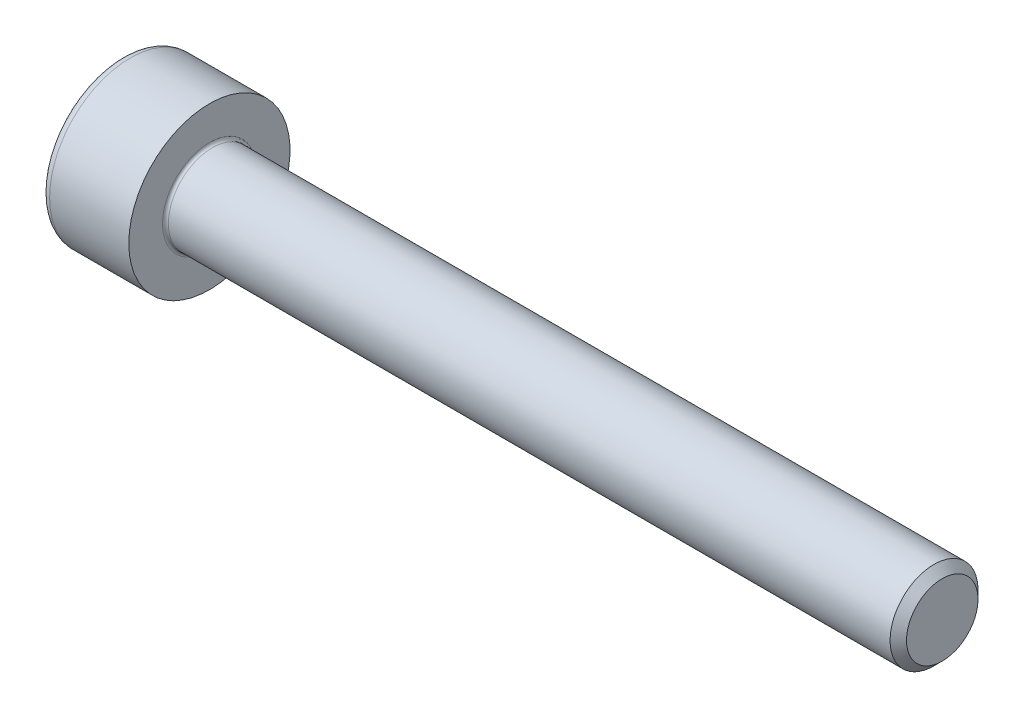
ISO-10303-21;
HEADER;
FILE_DESCRIPTION(('STEP AP214'),'2;1');
FILE_NAME('part.step','',(''),(''),'','','');
FILE_SCHEMA(('AUTOMOTIVE_DESIGN { 1 0 10303 214 1 1 1 1 }'));
ENDSEC;
DATA;
#1=APPLICATION_CONTEXT('core data for automotive mechanical design processes');
#2=APPLICATION_PROTOCOL_DEFINITION('international standard','automotive_design',2000,#1);
#3=PRODUCT_CONTEXT('',#1,'mechanical');
#4=PRODUCT('Part','Part','',(#3));
#5=PRODUCT_RELATED_PRODUCT_CATEGORY('part','',(#4));
#6=PRODUCT_DEFINITION_FORMATION('','',#4);
#7=PRODUCT_DEFINITION_CONTEXT('part definition',#1,'design');
#8=PRODUCT_DEFINITION('design','',#6,#7);
#9=PRODUCT_DEFINITION_SHAPE('','',#8);
#10=(LENGTH_UNIT() NAMED_UNIT(*) SI_UNIT(.MILLI.,.METRE.));
#11=(NAMED_UNIT(*) PLANE_ANGLE_UNIT() SI_UNIT($,.RADIAN.));
#12=(NAMED_UNIT(*) SI_UNIT($,.STERADIAN.) SOLID_ANGLE_UNIT());
#13=UNCERTAINTY_MEASURE_WITH_UNIT(LENGTH_MEASURE(1.E-05),#10,'distance_accuracy_value','');
#14=(GEOMETRIC_REPRESENTATION_CONTEXT(3) GLOBAL_UNCERTAINTY_ASSIGNED_CONTEXT((#13)) GLOBAL_UNIT_ASSIGNED_CONTEXT((#10,
#11,#12)) REPRESENTATION_CONTEXT('',''));
#15=CARTESIAN_POINT('',(0.,0.,0.));
#16=DIRECTION('',(0.,0.,1.));
#17=DIRECTION('',(1.,0.,0.));
#18=AXIS2_PLACEMENT_3D('',#15,#16,#17);
#19=CARTESIAN_POINT('',(0.,0.,0.));
#20=DIRECTION('',(-1.,0.,0.));
#21=DIRECTION('',(0.,0.,1.));
#22=AXIS2_PLACEMENT_3D('',#19,#20,#21);
#23=PLANE('',#22);
#24=DIRECTION('',(0.,-0.499999999999999,0.866025403784439));
#25=VECTOR('',#24,1.);
#26=CARTESIAN_POINT('',(0.,1.45492267835785,0.));
#27=LINE('',#26,#25);
#28=CARTESIAN_POINT('',(0.,1.45492267835785,0.));
#29=VERTEX_POINT('',#28);
#30=CARTESIAN_POINT('',(0.,0.727461339178925,1.26));
#31=VERTEX_POINT('',#30);
#32=EDGE_CURVE('E259',#29,#31,#27,.T.);
#33=ORIENTED_EDGE('',*,*,#32,.T.);
#34=DIRECTION('',(0.,1.,0.));
#35=VECTOR('',#34,1.);
#36=CARTESIAN_POINT('',(0.,-0.727461339178932,1.26));
#37=LINE('',#36,#35);
#38=CARTESIAN_POINT('',(0.,-0.727461339178932,1.26));
#39=VERTEX_POINT('',#38);
#40=EDGE_CURVE('E131',#39,#31,#37,.T.);
#41=ORIENTED_EDGE('',*,*,#40,.F.);
#42=DIRECTION('',(0.,-0.500000000000001,-0.866025403784438));
#43=VECTOR('',#42,1.);
#44=CARTESIAN_POINT('',(0.,-0.727461339178932,1.26));
#45=LINE('',#44,#43);
#46=CARTESIAN_POINT('',(0.,-1.45492267835786,0.));
#47=VERTEX_POINT('',#46);
#48=EDGE_CURVE('E262',#39,#47,#45,.T.);
#49=ORIENTED_EDGE('',*,*,#48,.T.);
#50=DIRECTION('',(0.,0.499999999999999,-0.866025403784439));
#51=VECTOR('',#50,1.);
#52=CARTESIAN_POINT('',(0.,-1.45492267835786,0.));
#53=LINE('',#52,#51);
#54=CARTESIAN_POINT('',(0.,-0.727461339178935,-1.26));
#55=VERTEX_POINT('',#54);
#56=EDGE_CURVE('E265',#47,#55,#53,.T.);
#57=ORIENTED_EDGE('',*,*,#56,.T.);
#58=DIRECTION('',(0.,-1.,0.));
#59=VECTOR('',#58,1.);
#60=CARTESIAN_POINT('',(0.,0.727461339178922,-1.26));
#61=LINE('',#60,#59);
#62=CARTESIAN_POINT('',(0.,0.727461339178922,-1.26));
#63=VERTEX_POINT('',#62);
#64=EDGE_CURVE('E268',#63,#55,#61,.T.);
#65=ORIENTED_EDGE('',*,*,#64,.F.);
#66=DIRECTION('',(0.,-0.500000000000001,-0.866025403784438));
#67=VECTOR('',#66,1.);
#68=CARTESIAN_POINT('',(0.,1.45492267835785,0.));
#69=LINE('',#68,#67);
#70=EDGE_CURVE('E126',#29,#63,#69,.T.);
#71=ORIENTED_EDGE('',*,*,#70,.F.);
#72=EDGE_LOOP('',(#33,#41,#49,#57,#65,#71));
#73=FACE_BOUND('',#72,.T.);
#74=CARTESIAN_POINT('',(0.,0.,0.));
#75=DIRECTION('',(-1.,0.,0.));
#76=DIRECTION('',(0.,0.,1.));
#77=AXIS2_PLACEMENT_3D('',#74,#75,#76);
#78=CIRCLE('',#77,2.45);
#79=CARTESIAN_POINT('',(0.,0.,2.45));
#80=VERTEX_POINT('',#79);
#81=EDGE_CURVE('E43',#80,#80,#78,.T.);
#82=ORIENTED_EDGE('',*,*,#81,.T.);
#83=EDGE_LOOP('',(#82));
#84=FACE_BOUND('',#83,.T.);
#85=ADVANCED_FACE('F35',(#73,#84),#23,.T.);
#86=CARTESIAN_POINT('',(-31.75,0.,0.));
#87=DIRECTION('',(-1.,0.,0.));
#88=DIRECTION('',(0.,0.,1.));
#89=AXIS2_PLACEMENT_3D('',#86,#87,#88);
#90=CYLINDRICAL_SURFACE('',#89,2.75);
#91=CARTESIAN_POINT('',(0.300000000000002,0.,0.));
#92=DIRECTION('',(-1.,0.,0.));
#93=DIRECTION('',(0.,0.,1.));
#94=AXIS2_PLACEMENT_3D('',#91,#92,#93);
#95=CIRCLE('',#94,2.75);
#96=CARTESIAN_POINT('',(0.300000000000002,0.,2.75));
#97=VERTEX_POINT('',#96);
#98=EDGE_CURVE('E11',#97,#97,#95,.F.);
#99=ORIENTED_EDGE('',*,*,#98,.T.);
#100=EDGE_LOOP('',(#99));
#101=FACE_BOUND('',#100,.T.);
#102=CARTESIAN_POINT('',(3.,0.,0.));
#103=DIRECTION('',(-1.,0.,0.));
#104=DIRECTION('',(0.,0.,1.));
#105=AXIS2_PLACEMENT_3D('',#102,#103,#104);
#106=CIRCLE('',#105,2.75);
#107=CARTESIAN_POINT('',(3.,0.,2.75));
#108=VERTEX_POINT('',#107);
#109=EDGE_CURVE('E149',#108,#108,#106,.T.);
#110=ORIENTED_EDGE('',*,*,#109,.T.);
#111=EDGE_LOOP('',(#110));
#112=FACE_BOUND('',#111,.T.);
#113=ADVANCED_FACE('F173',(#101,#112),#90,.T.);
#114=CARTESIAN_POINT('',(3.,2.75,0.));
#115=DIRECTION('',(1.,0.,0.));
#116=DIRECTION('',(0.,0.,-1.));
#117=AXIS2_PLACEMENT_3D('',#114,#115,#116);
#118=PLANE('',#117);
#119=CARTESIAN_POINT('',(3.,0.,0.));
#120=DIRECTION('',(1.,0.,0.));
#121=DIRECTION('',(0.,0.,-1.));
#122=AXIS2_PLACEMENT_3D('',#119,#120,#121);
#123=CIRCLE('',#122,1.59999999999996);
#124=CARTESIAN_POINT('',(3.,0.,-1.59999999999996));
#125=VERTEX_POINT('',#124);
#126=EDGE_CURVE('E152',#125,#125,#123,.F.);
#127=ORIENTED_EDGE('',*,*,#126,.T.);
#128=EDGE_LOOP('',(#127));
#129=FACE_BOUND('',#128,.T.);
#130=ORIENTED_EDGE('',*,*,#109,.F.);
#131=EDGE_LOOP('',(#130));
#132=FACE_BOUND('',#131,.T.);
#133=ADVANCED_FACE('F179',(#129,#132),#118,.T.);
#134=CARTESIAN_POINT('',(-31.75,0.,0.));
#135=DIRECTION('',(-1.,0.,0.));
#136=DIRECTION('',(0.,0.,1.));
#137=AXIS2_PLACEMENT_3D('',#134,#135,#136);
#138=CYLINDRICAL_SURFACE('',#137,1.49999999999996);
#139=CARTESIAN_POINT('',(3.1,0.,0.));
#140=DIRECTION('',(1.,0.,0.));
#141=DIRECTION('',(0.,0.,-1.));
#142=AXIS2_PLACEMENT_3D('',#139,#140,#141);
#143=CIRCLE('',#142,1.49999999999996);
#144=CARTESIAN_POINT('',(3.1,0.,-1.49999999999996));
#145=VERTEX_POINT('',#144);
#146=EDGE_CURVE('E155',#145,#145,#143,.T.);
#147=ORIENTED_EDGE('',*,*,#146,.T.);
#148=EDGE_LOOP('',(#147));
#149=FACE_BOUND('',#148,.T.);
#150=CARTESIAN_POINT('',(27.7194999999999,0.,0.));
#151=DIRECTION('',(-1.,0.,0.));
#152=DIRECTION('',(0.,0.,1.));
#153=AXIS2_PLACEMENT_3D('',#150,#151,#152);
#154=CIRCLE('',#153,1.49999999999992);
#155=CARTESIAN_POINT('',(27.7194999999999,0.,1.49999999999992));
#156=VERTEX_POINT('',#155);
#157=EDGE_CURVE('E146',#156,#156,#154,.T.);
#158=ORIENTED_EDGE('',*,*,#157,.T.);
#159=EDGE_LOOP('',(#158));
#160=FACE_BOUND('',#159,.T.);
#161=ADVANCED_FACE('F185',(#149,#160),#138,.T.);
#162=CARTESIAN_POINT('',(28.,0.,0.));
#163=DIRECTION('',(-1.,0.,0.));
#164=DIRECTION('',(0.,0.,1.));
#165=AXIS2_PLACEMENT_3D('',#162,#163,#164);
#166=CONICAL_SURFACE('',#165,1.2195,0.785398163397178);
#167=ORIENTED_EDGE('',*,*,#157,.F.);
#168=EDGE_LOOP('',(#167));
#169=FACE_BOUND('',#168,.T.);
#170=CARTESIAN_POINT('',(28.,0.,0.));
#171=DIRECTION('',(-1.,0.,0.));
#172=DIRECTION('',(0.,0.,1.));
#173=AXIS2_PLACEMENT_3D('',#170,#171,#172);
#174=CIRCLE('',#173,1.2195);
#175=CARTESIAN_POINT('',(28.,0.,1.2195));
#176=VERTEX_POINT('',#175);
#177=EDGE_CURVE('E142',#176,#176,#174,.T.);
#178=ORIENTED_EDGE('',*,*,#177,.T.);
#179=EDGE_LOOP('',(#178));
#180=FACE_BOUND('',#179,.T.);
#181=ADVANCED_FACE('F189',(#169,#180),#166,.T.);
#182=CARTESIAN_POINT('',(28.,1.2195,0.));
#183=DIRECTION('',(1.,0.,0.));
#184=DIRECTION('',(0.,0.,-1.));
#185=AXIS2_PLACEMENT_3D('',#182,#183,#184);
#186=PLANE('',#185);
#187=ORIENTED_EDGE('',*,*,#177,.F.);
#188=EDGE_LOOP('',(#187));
#189=FACE_BOUND('',#188,.T.);
#190=ADVANCED_FACE('F169',(#189),#186,.T.);
#191=CARTESIAN_POINT('',(3.1,0.,0.));
#192=DIRECTION('',(1.,0.,0.));
#193=DIRECTION('',(0.,0.,-1.));
#194=AXIS2_PLACEMENT_3D('',#191,#192,#193);
#195=TOROIDAL_SURFACE('',#194,1.59999999999996,0.1);
#196=ORIENTED_EDGE('',*,*,#146,.F.);
#197=EDGE_LOOP('',(#196));
#198=FACE_BOUND('',#197,.T.);
#199=ORIENTED_EDGE('',*,*,#126,.F.);
#200=EDGE_LOOP('',(#199));
#201=FACE_BOUND('',#200,.T.);
#202=ADVANCED_FACE('F162',(#198,#201),#195,.F.);
#203=CARTESIAN_POINT('',(0.300000000000002,0.,0.));
#204=DIRECTION('',(-1.,0.,0.));
#205=DIRECTION('',(0.,0.,1.));
#206=AXIS2_PLACEMENT_3D('',#203,#204,#205);
#207=TOROIDAL_SURFACE('',#206,2.45,0.3);
#208=ORIENTED_EDGE('',*,*,#98,.F.);
#209=EDGE_LOOP('',(#208));
#210=FACE_BOUND('',#209,.T.);
#211=ORIENTED_EDGE('',*,*,#81,.F.);
#212=EDGE_LOOP('',(#211));
#213=FACE_BOUND('',#212,.T.);
#214=ADVANCED_FACE('F37',(#210,#213),#207,.T.);
#215=CARTESIAN_POINT('',(1.3,1.45492267835785,0.));
#216=DIRECTION('',(0.,-0.866025403784439,-0.499999999999999));
#217=DIRECTION('',(0.,0.499999999999999,-0.866025403784439));
#218=AXIS2_PLACEMENT_3D('',#215,#216,#217);
#219=PLANE('',#218);
#220=ORIENTED_EDGE('',*,*,#32,.F.);
#221=DIRECTION('',(-1.,0.,0.));
#222=VECTOR('',#221,1.);
#223=CARTESIAN_POINT('',(1.3,1.45492267835785,0.));
#224=LINE('',#223,#222);
#225=CARTESIAN_POINT('',(1.3,1.45492267835785,0.));
#226=VERTEX_POINT('',#225);
#227=EDGE_CURVE('E249',#226,#29,#224,.T.);
#228=ORIENTED_EDGE('',*,*,#227,.F.);
#229=DIRECTION('',(0.,-0.499999999999999,0.866025403784439));
#230=VECTOR('',#229,1.);
#231=CARTESIAN_POINT('',(1.3,1.45492267835785,0.));
#232=LINE('',#231,#230);
#233=CARTESIAN_POINT('',(1.3,1.09119200876839,0.629999999999996));
#234=VERTEX_POINT('',#233);
#235=EDGE_CURVE('E118',#226,#234,#232,.T.);
#236=ORIENTED_EDGE('',*,*,#235,.T.);
#237=CARTESIAN_POINT('',(1.3,0.727461339178925,1.26));
#238=VERTEX_POINT('',#237);
#239=EDGE_CURVE('E109',#234,#238,#232,.T.);
#240=ORIENTED_EDGE('',*,*,#239,.T.);
#241=DIRECTION('',(-1.,0.,0.));
#242=VECTOR('',#241,1.);
#243=CARTESIAN_POINT('',(1.3,0.727461339178925,1.26));
#244=LINE('',#243,#242);
#245=EDGE_CURVE('E123',#238,#31,#244,.T.);
#246=ORIENTED_EDGE('',*,*,#245,.T.);
#247=EDGE_LOOP('',(#220,#228,#236,#240,#246));
#248=FACE_BOUND('',#247,.T.);
#249=ADVANCED_FACE('F122',(#248),#219,.T.);
#250=CARTESIAN_POINT('',(1.3,-0.727461339178932,1.26));
#251=DIRECTION('',(0.,0.,1.));
#252=DIRECTION('',(0.,-1.,0.));
#253=AXIS2_PLACEMENT_3D('',#250,#251,#252);
#254=PLANE('',#253);
#255=ORIENTED_EDGE('',*,*,#40,.T.);
#256=ORIENTED_EDGE('',*,*,#245,.F.);
#257=DIRECTION('',(0.,1.,0.));
#258=VECTOR('',#257,1.);
#259=CARTESIAN_POINT('',(1.3,-0.727461339178932,1.26));
#260=LINE('',#259,#258);
#261=CARTESIAN_POINT('',(1.3,0.,1.26));
#262=VERTEX_POINT('',#261);
#263=EDGE_CURVE('E106',#262,#238,#260,.T.);
#264=ORIENTED_EDGE('',*,*,#263,.F.);
#265=CARTESIAN_POINT('',(1.3,-0.727461339178932,1.26));
#266=VERTEX_POINT('',#265);
#267=EDGE_CURVE('E117',#266,#262,#260,.T.);
#268=ORIENTED_EDGE('',*,*,#267,.F.);
#269=DIRECTION('',(-1.,0.,0.));
#270=VECTOR('',#269,1.);
#271=CARTESIAN_POINT('',(1.3,-0.727461339178932,1.26));
#272=LINE('',#271,#270);
#273=EDGE_CURVE('E133',#266,#39,#272,.T.);
#274=ORIENTED_EDGE('',*,*,#273,.T.);
#275=EDGE_LOOP('',(#255,#256,#264,#268,#274));
#276=FACE_BOUND('',#275,.T.);
#277=ADVANCED_FACE('F128',(#276),#254,.F.);
#278=CARTESIAN_POINT('',(1.3,-0.727461339178932,1.26));
#279=DIRECTION('',(0.,0.866025403784438,-0.500000000000001));
#280=DIRECTION('',(0.,0.500000000000001,0.866025403784438));
#281=AXIS2_PLACEMENT_3D('',#278,#279,#280);
#282=PLANE('',#281);
#283=ORIENTED_EDGE('',*,*,#48,.F.);
#284=ORIENTED_EDGE('',*,*,#273,.F.);
#285=DIRECTION('',(0.,-0.500000000000001,-0.866025403784438));
#286=VECTOR('',#285,1.);
#287=CARTESIAN_POINT('',(1.3,-0.727461339178932,1.26));
#288=LINE('',#287,#286);
#289=CARTESIAN_POINT('',(1.3,-1.0911920087684,0.630000000000003));
#290=VERTEX_POINT('',#289);
#291=EDGE_CURVE('E288',#266,#290,#288,.T.);
#292=ORIENTED_EDGE('',*,*,#291,.T.);
#293=CARTESIAN_POINT('',(1.3,-1.45492267835786,0.));
#294=VERTEX_POINT('',#293);
#295=EDGE_CURVE('E277',#290,#294,#288,.T.);
#296=ORIENTED_EDGE('',*,*,#295,.T.);
#297=DIRECTION('',(-1.,0.,0.));
#298=VECTOR('',#297,1.);
#299=CARTESIAN_POINT('',(1.3,-1.45492267835786,0.));
#300=LINE('',#299,#298);
#301=EDGE_CURVE('E138',#294,#47,#300,.T.);
#302=ORIENTED_EDGE('',*,*,#301,.T.);
#303=EDGE_LOOP('',(#283,#284,#292,#296,#302));
#304=FACE_BOUND('',#303,.T.);
#305=ADVANCED_FACE('F203',(#304),#282,.T.);
#306=CARTESIAN_POINT('',(1.3,-1.45492267835786,0.));
#307=DIRECTION('',(0.,0.866025403784439,0.499999999999999));
#308=DIRECTION('',(0.,-0.499999999999999,0.866025403784439));
#309=AXIS2_PLACEMENT_3D('',#306,#307,#308);
#310=PLANE('',#309);
#311=ORIENTED_EDGE('',*,*,#56,.F.);
#312=ORIENTED_EDGE('',*,*,#301,.F.);
#313=DIRECTION('',(0.,0.499999999999999,-0.866025403784439));
#314=VECTOR('',#313,1.);
#315=CARTESIAN_POINT('',(1.3,-1.45492267835786,0.));
#316=LINE('',#315,#314);
#317=CARTESIAN_POINT('',(1.3,-1.0911920087684,-0.630000000000002));
#318=VERTEX_POINT('',#317);
#319=EDGE_CURVE('E255',#294,#318,#316,.T.);
#320=ORIENTED_EDGE('',*,*,#319,.T.);
#321=CARTESIAN_POINT('',(1.3,-0.727461339178935,-1.26));
#322=VERTEX_POINT('',#321);
#323=EDGE_CURVE('E287',#318,#322,#316,.T.);
#324=ORIENTED_EDGE('',*,*,#323,.T.);
#325=DIRECTION('',(-1.,0.,0.));
#326=VECTOR('',#325,1.);
#327=CARTESIAN_POINT('',(1.3,-0.727461339178935,-1.26));
#328=LINE('',#327,#326);
#329=EDGE_CURVE('E248',#322,#55,#328,.T.);
#330=ORIENTED_EDGE('',*,*,#329,.T.);
#331=EDGE_LOOP('',(#311,#312,#320,#324,#330));
#332=FACE_BOUND('',#331,.T.);
#333=ADVANCED_FACE('F206',(#332),#310,.T.);
#334=CARTESIAN_POINT('',(1.3,0.727461339178922,-1.26));
#335=DIRECTION('',(0.,0.,-1.));
#336=DIRECTION('',(0.,1.,0.));
#337=AXIS2_PLACEMENT_3D('',#334,#335,#336);
#338=PLANE('',#337);
#339=ORIENTED_EDGE('',*,*,#64,.T.);
#340=ORIENTED_EDGE('',*,*,#329,.F.);
#341=DIRECTION('',(0.,-1.,0.));
#342=VECTOR('',#341,1.);
#343=CARTESIAN_POINT('',(1.3,0.727461339178922,-1.26));
#344=LINE('',#343,#342);
#345=CARTESIAN_POINT('',(1.3,0.,-1.26));
#346=VERTEX_POINT('',#345);
#347=EDGE_CURVE('E252',#346,#322,#344,.T.);
#348=ORIENTED_EDGE('',*,*,#347,.F.);
#349=CARTESIAN_POINT('',(1.3,0.727461339178922,-1.26));
#350=VERTEX_POINT('',#349);
#351=EDGE_CURVE('E50',#350,#346,#344,.T.);
#352=ORIENTED_EDGE('',*,*,#351,.F.);
#353=DIRECTION('',(-1.,0.,0.));
#354=VECTOR('',#353,1.);
#355=CARTESIAN_POINT('',(1.3,0.727461339178922,-1.26));
#356=LINE('',#355,#354);
#357=EDGE_CURVE('E245',#350,#63,#356,.T.);
#358=ORIENTED_EDGE('',*,*,#357,.T.);
#359=EDGE_LOOP('',(#339,#340,#348,#352,#358));
#360=FACE_BOUND('',#359,.T.);
#361=ADVANCED_FACE('F210',(#360),#338,.F.);
#362=CARTESIAN_POINT('',(1.3,1.45492267835785,0.));
#363=DIRECTION('',(0.,0.866025403784438,-0.500000000000001));
#364=DIRECTION('',(0.,0.500000000000001,0.866025403784438));
#365=AXIS2_PLACEMENT_3D('',#362,#363,#364);
#366=PLANE('',#365);
#367=ORIENTED_EDGE('',*,*,#70,.T.);
#368=ORIENTED_EDGE('',*,*,#357,.F.);
#369=DIRECTION('',(0.,-0.500000000000001,-0.866025403784438));
#370=VECTOR('',#369,1.);
#371=CARTESIAN_POINT('',(1.3,1.45492267835785,0.));
#372=LINE('',#371,#370);
#373=CARTESIAN_POINT('',(1.3,1.09119200876839,-0.63));
#374=VERTEX_POINT('',#373);
#375=EDGE_CURVE('E235',#374,#350,#372,.T.);
#376=ORIENTED_EDGE('',*,*,#375,.F.);
#377=EDGE_CURVE('E241',#226,#374,#372,.T.);
#378=ORIENTED_EDGE('',*,*,#377,.F.);
#379=ORIENTED_EDGE('',*,*,#227,.T.);
#380=EDGE_LOOP('',(#367,#368,#376,#378,#379));
#381=FACE_BOUND('',#380,.T.);
#382=ADVANCED_FACE('F214',(#381),#366,.F.);
#383=CARTESIAN_POINT('',(1.3,1.45492267835785,0.));
#384=DIRECTION('',(1.,0.,0.));
#385=DIRECTION('',(0.,0.,-1.));
#386=AXIS2_PLACEMENT_3D('',#383,#384,#385);
#387=PLANE('',#386);
#388=ORIENTED_EDGE('',*,*,#347,.T.);
#389=ORIENTED_EDGE('',*,*,#323,.F.);
#390=CARTESIAN_POINT('',(1.3,0.,0.));
#391=DIRECTION('',(-1.,0.,0.));
#392=DIRECTION('',(0.,0.,1.));
#393=AXIS2_PLACEMENT_3D('',#390,#391,#392);
#394=CIRCLE('',#393,1.26);
#395=EDGE_CURVE('E283',#346,#318,#394,.T.);
#396=ORIENTED_EDGE('',*,*,#395,.F.);
#397=EDGE_LOOP('',(#388,#389,#396));
#398=FACE_BOUND('',#397,.T.);
#399=ADVANCED_FACE('F218',(#398),#387,.F.);
#400=ORIENTED_EDGE('',*,*,#319,.F.);
#401=ORIENTED_EDGE('',*,*,#295,.F.);
#402=EDGE_CURVE('E136',#318,#290,#394,.T.);
#403=ORIENTED_EDGE('',*,*,#402,.F.);
#404=EDGE_LOOP('',(#400,#401,#403));
#405=FACE_BOUND('',#404,.T.);
#406=ADVANCED_FACE('F221',(#405),#387,.F.);
#407=ORIENTED_EDGE('',*,*,#291,.F.);
#408=ORIENTED_EDGE('',*,*,#267,.T.);
#409=EDGE_CURVE('E132',#290,#262,#394,.T.);
#410=ORIENTED_EDGE('',*,*,#409,.F.);
#411=EDGE_LOOP('',(#407,#408,#410));
#412=FACE_BOUND('',#411,.T.);
#413=ADVANCED_FACE('F226',(#412),#387,.F.);
#414=ORIENTED_EDGE('',*,*,#263,.T.);
#415=ORIENTED_EDGE('',*,*,#239,.F.);
#416=EDGE_CURVE('E112',#262,#234,#394,.T.);
#417=ORIENTED_EDGE('',*,*,#416,.F.);
#418=EDGE_LOOP('',(#414,#415,#417));
#419=FACE_BOUND('',#418,.T.);
#420=ADVANCED_FACE('F108',(#419),#387,.F.);
#421=ORIENTED_EDGE('',*,*,#235,.F.);
#422=ORIENTED_EDGE('',*,*,#377,.T.);
#423=EDGE_CURVE('E143',#234,#374,#394,.T.);
#424=ORIENTED_EDGE('',*,*,#423,.F.);
#425=EDGE_LOOP('',(#421,#422,#424));
#426=FACE_BOUND('',#425,.T.);
#427=ADVANCED_FACE('F229',(#426),#387,.F.);
#428=ORIENTED_EDGE('',*,*,#375,.T.);
#429=ORIENTED_EDGE('',*,*,#351,.T.);
#430=EDGE_CURVE('E238',#374,#346,#394,.T.);
#431=ORIENTED_EDGE('',*,*,#430,.F.);
#432=EDGE_LOOP('',(#428,#429,#431));
#433=FACE_BOUND('',#432,.T.);
#434=ADVANCED_FACE('F199',(#433),#387,.F.);
#435=CARTESIAN_POINT('',(1.3,0.,0.));
#436=DIRECTION('',(-1.,0.,0.));
#437=DIRECTION('',(0.,0.,1.));
#438=AXIS2_PLACEMENT_3D('',#435,#436,#437);
#439=CONICAL_SURFACE('',#438,1.26,1.04719755119659);
#440=CARTESIAN_POINT('',(2.02746133917894,0.,0.));
#441=VERTEX_POINT('',#440);
#442=VERTEX_LOOP('',#441);
#443=FACE_BOUND('',#442,.T.);
#444=ORIENTED_EDGE('',*,*,#416,.T.);
#445=ORIENTED_EDGE('',*,*,#423,.T.);
#446=ORIENTED_EDGE('',*,*,#430,.T.);
#447=ORIENTED_EDGE('',*,*,#395,.T.);
#448=ORIENTED_EDGE('',*,*,#402,.T.);
#449=ORIENTED_EDGE('',*,*,#409,.T.);
#450=EDGE_LOOP('',(#444,#445,#446,#447,#448,#449));
#451=FACE_BOUND('',#450,.T.);
#452=ADVANCED_FACE('F197',(#443,#451),#439,.F.);
#453=CLOSED_SHELL('',(#85,#113,#133,#161,#181,#190,#202,#214,#249,#277,#305,#333,#361,#382,#399,
#406,#413,#420,#427,#434,#452));
#454=MANIFOLD_SOLID_BREP('B2',#453);
#455=ADVANCED_BREP_SHAPE_REPRESENTATION('',(#18,#454),#14);
#456=SHAPE_DEFINITION_REPRESENTATION(#9,#455);
ENDSEC;
END-ISO-10303-21;
